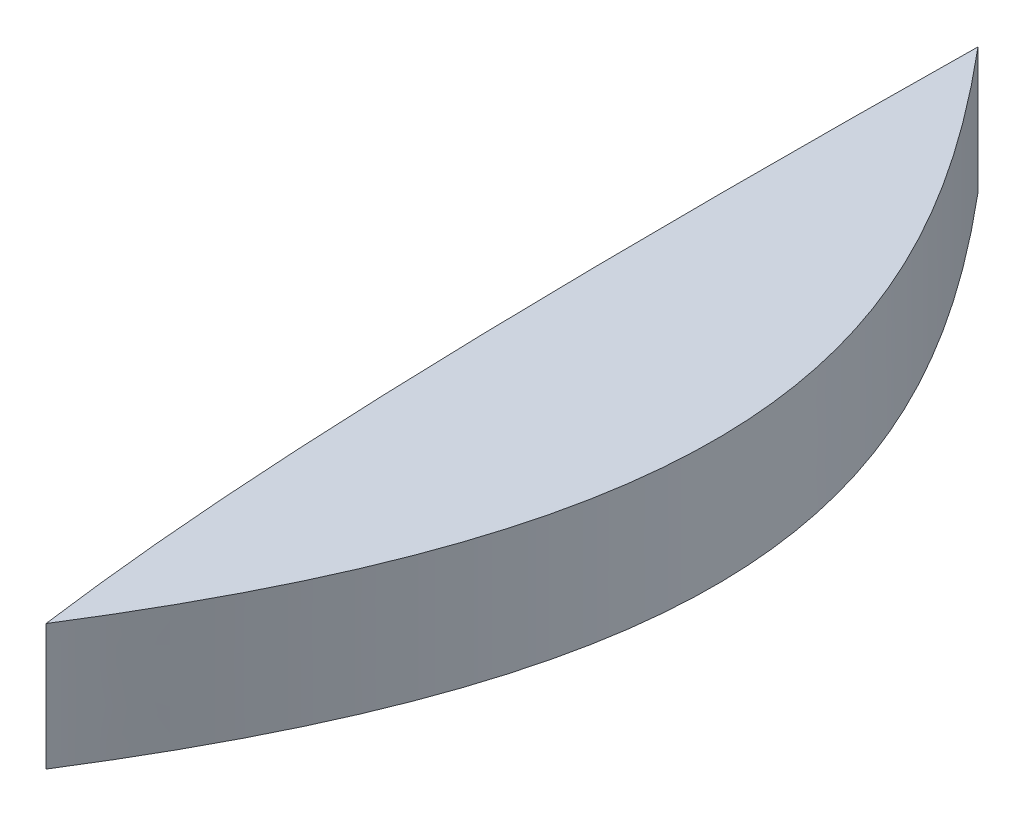
ISO-10303-21;
HEADER;
FILE_DESCRIPTION(('STEP AP214'),'2;1');
FILE_NAME('part.step','',(''),(''),'','','');
FILE_SCHEMA(('AUTOMOTIVE_DESIGN { 1 0 10303 214 1 1 1 1 }'));
ENDSEC;
DATA;
#1=APPLICATION_CONTEXT('core data for automotive mechanical design processes');
#2=APPLICATION_PROTOCOL_DEFINITION('international standard','automotive_design',2000,#1);
#3=PRODUCT_CONTEXT('',#1,'mechanical');
#4=PRODUCT('Part','Part','',(#3));
#5=PRODUCT_RELATED_PRODUCT_CATEGORY('part','',(#4));
#6=PRODUCT_DEFINITION_FORMATION('','',#4);
#7=PRODUCT_DEFINITION_CONTEXT('part definition',#1,'design');
#8=PRODUCT_DEFINITION('design','',#6,#7);
#9=PRODUCT_DEFINITION_SHAPE('','',#8);
#10=(LENGTH_UNIT() NAMED_UNIT(*) SI_UNIT(.MILLI.,.METRE.));
#11=(NAMED_UNIT(*) PLANE_ANGLE_UNIT() SI_UNIT($,.RADIAN.));
#12=(NAMED_UNIT(*) SI_UNIT($,.STERADIAN.) SOLID_ANGLE_UNIT());
#13=UNCERTAINTY_MEASURE_WITH_UNIT(LENGTH_MEASURE(1.E-05),#10,'distance_accuracy_value','');
#14=(GEOMETRIC_REPRESENTATION_CONTEXT(3) GLOBAL_UNCERTAINTY_ASSIGNED_CONTEXT((#13)) GLOBAL_UNIT_ASSIGNED_CONTEXT((#10,
#11,#12)) REPRESENTATION_CONTEXT('',''));
#15=CARTESIAN_POINT('',(0.,0.,0.));
#16=DIRECTION('',(0.,0.,1.));
#17=DIRECTION('',(1.,0.,0.));
#18=AXIS2_PLACEMENT_3D('',#15,#16,#17);
#19=CARTESIAN_POINT('',(76.4763346626368,-15.7359999999999,53.5629023710989));
#20=CARTESIAN_POINT('',(83.9772158726976,-15.7359999999999,62.471120596468));
#21=CARTESIAN_POINT('',(86.1364385946051,-15.7359999999999,70.5152754093578));
#22=CARTESIAN_POINT('',(77.5358351560387,-15.7359999999999,84.1913918151022));
#23=B_SPLINE_CURVE_WITH_KNOTS('',3,(#19,#20,#21,#22),.UNSPECIFIED.,.F.,.F.,(4,4),(0.,1.),.UNSPECIFIED.);
#24=DIRECTION('',(0.,1.,0.));
#25=VECTOR('',#24,1.);
#26=SURFACE_OF_LINEAR_EXTRUSION('',#23,#25);
#27=CARTESIAN_POINT('',(76.4763346626368,-11.7359999999999,53.5629023710989));
#28=CARTESIAN_POINT('',(83.9772158726976,-11.7359999999999,62.471120596468));
#29=CARTESIAN_POINT('',(86.1364385946051,-11.7359999999999,70.5152754093578));
#30=CARTESIAN_POINT('',(77.5358351560387,-11.7359999999999,84.1913918151022));
#31=B_SPLINE_CURVE_WITH_KNOTS('',3,(#27,#28,#29,#30),.UNSPECIFIED.,.F.,.F.,(4,4),(0.,1.),.UNSPECIFIED.);
#32=CARTESIAN_POINT('',(76.4764459270236,-11.7359999999999,53.5630345115315));
#33=VERTEX_POINT('',#32);
#34=CARTESIAN_POINT('',(77.5360614196237,-11.7359999999999,84.191032022917));
#35=VERTEX_POINT('',#34);
#36=EDGE_CURVE('E77',#33,#35,#31,.T.);
#37=ORIENTED_EDGE('',*,*,#36,.T.);
#38=DIRECTION('',(0.,1.,0.));
#39=VECTOR('',#38,1.);
#40=CARTESIAN_POINT('',(77.5360614196237,-15.7359999999999,84.191032022917));
#41=LINE('',#40,#39);
#42=CARTESIAN_POINT('',(77.5360614196237,-15.7359999999999,84.191032022917));
#43=VERTEX_POINT('',#42);
#44=EDGE_CURVE('E11',#43,#35,#41,.T.);
#45=ORIENTED_EDGE('',*,*,#44,.F.);
#46=CARTESIAN_POINT('',(76.4764459270236,-15.7359999999999,53.5630345115315));
#47=VERTEX_POINT('',#46);
#48=EDGE_CURVE('E71',#47,#43,#23,.T.);
#49=ORIENTED_EDGE('',*,*,#48,.F.);
#50=DIRECTION('',(0.,1.,0.));
#51=VECTOR('',#50,1.);
#52=CARTESIAN_POINT('',(76.4764459270236,-15.7359999999999,53.5630345115315));
#53=LINE('',#52,#51);
#54=EDGE_CURVE('E78',#47,#33,#53,.T.);
#55=ORIENTED_EDGE('',*,*,#54,.T.);
#56=EDGE_LOOP('',(#37,#45,#49,#55));
#57=FACE_BOUND('',#56,.T.);
#58=ADVANCED_FACE('F30',(#57),#26,.F.);
#59=CARTESIAN_POINT('',(77.5360614196237,-15.7359999999999,84.191032022917));
#60=DIRECTION('',(0.117809139059912,0.,-0.993036256515321));
#61=DIRECTION('',(-0.993036256515321,0.,-0.117809139059912));
#62=AXIS2_PLACEMENT_3D('',#59,#60,#61);
#63=PLANE('',#62);
#64=DIRECTION('',(-0.993036256515321,0.,-0.117809139059912));
#65=VECTOR('',#64,1.);
#66=CARTESIAN_POINT('',(77.5360614196237,-11.7359999999999,84.191032022917));
#67=LINE('',#66,#65);
#68=CARTESIAN_POINT('',(77.5359224096586,-11.7359999999999,84.1910155314302));
#69=VERTEX_POINT('',#68);
#70=EDGE_CURVE('E59',#35,#69,#67,.T.);
#71=ORIENTED_EDGE('',*,*,#70,.T.);
#72=DIRECTION('',(0.,1.,0.));
#73=VECTOR('',#72,1.);
#74=CARTESIAN_POINT('',(77.5359224096586,-15.7359999999999,84.1910155314302));
#75=LINE('',#74,#73);
#76=CARTESIAN_POINT('',(77.5359224096586,-15.7359999999999,84.1910155314302));
#77=VERTEX_POINT('',#76);
#78=EDGE_CURVE('E39',#77,#69,#75,.T.);
#79=ORIENTED_EDGE('',*,*,#78,.F.);
#80=DIRECTION('',(-0.993036256515321,0.,-0.117809139059912));
#81=VECTOR('',#80,1.);
#82=CARTESIAN_POINT('',(77.5360614196237,-15.7359999999999,84.191032022917));
#83=LINE('',#82,#81);
#84=EDGE_CURVE('E67',#43,#77,#83,.T.);
#85=ORIENTED_EDGE('',*,*,#84,.F.);
#86=ORIENTED_EDGE('',*,*,#44,.T.);
#87=EDGE_LOOP('',(#71,#79,#85,#86));
#88=FACE_BOUND('',#87,.T.);
#89=ADVANCED_FACE('F68',(#88),#63,.F.);
#90=CARTESIAN_POINT('',(77.5359482155555,-15.7359999999999,84.1912120346007));
#91=CARTESIAN_POINT('',(77.5028715050359,-15.7359999999999,83.939344079596));
#92=CARTESIAN_POINT('',(77.4367065558592,-15.7359999999999,83.4355203867232));
#93=CARTESIAN_POINT('',(77.3449752692857,-15.7359999999999,82.6785290550212));
#94=CARTESIAN_POINT('',(77.2459595278376,-15.7359999999999,81.8074242638747));
#95=CARTESIAN_POINT('',(77.1432297499354,-15.7359999999999,80.8168707922648));
#96=CARTESIAN_POINT('',(77.0063658952545,-15.7359999999999,79.3408986704013));
#97=CARTESIAN_POINT('',(76.8074950642307,-15.7359999999999,76.7535028366324));
#98=CARTESIAN_POINT('',(76.6153366055633,-15.7359999999999,73.0555317320625));
#99=CARTESIAN_POINT('',(76.4839254246952,-15.7359999999999,68.6142902194999));
#100=CARTESIAN_POINT('',(76.4240547149905,-15.7359999999999,64.1706781013149));
#101=CARTESIAN_POINT('',(76.4174921302925,-15.7359999999999,59.7259777298219));
#102=CARTESIAN_POINT('',(76.4430872015544,-15.7359999999999,56.1899519650158));
#103=CARTESIAN_POINT('',(76.4691730639972,-15.7359999999999,54.1357545586011));
#104=CARTESIAN_POINT('',(76.4764459270236,-15.7359999999999,53.5630345115315));
#105=B_SPLINE_CURVE_WITH_KNOTS('',3,(#90,#91,#92,#93,#94,#95,#96,#97,#98,#99,#100,#101,#102,
#103,#104),.UNSPECIFIED.,.F.,.F.,(4,1,1,1,1,1,1,1,1,1,1,1,4),(0.,0.024846780740293,
0.0497022212624952,0.0745823004380216,0.110598145599614,0.147106319784745,0.219564905527315,
0.364403668242395,0.509244520351113,0.654134017511262,0.799061349588922,0.943977344649467,1.),.UNSPECIFIED.);
#106=DIRECTION('',(0.,1.,0.));
#107=VECTOR('',#106,1.);
#108=SURFACE_OF_LINEAR_EXTRUSION('',#105,#107);
#109=CARTESIAN_POINT('',(77.5359482155555,-11.7359999999999,84.1912120346007));
#110=CARTESIAN_POINT('',(77.5028715050359,-11.7359999999999,83.939344079596));
#111=CARTESIAN_POINT('',(77.4367065558592,-11.7359999999999,83.4355203867232));
#112=CARTESIAN_POINT('',(77.3449752692857,-11.7359999999999,82.6785290550212));
#113=CARTESIAN_POINT('',(77.2459595278376,-11.7359999999999,81.8074242638747));
#114=CARTESIAN_POINT('',(77.1432297499354,-11.7359999999999,80.8168707922648));
#115=CARTESIAN_POINT('',(77.0063658952545,-11.7359999999999,79.3408986704013));
#116=CARTESIAN_POINT('',(76.8074950642307,-11.7359999999999,76.7535028366324));
#117=CARTESIAN_POINT('',(76.6153366055633,-11.7359999999999,73.0555317320625));
#118=CARTESIAN_POINT('',(76.4839254246952,-11.7359999999999,68.6142902194999));
#119=CARTESIAN_POINT('',(76.4240547149905,-11.7359999999999,64.1706781013149));
#120=CARTESIAN_POINT('',(76.4174921302925,-11.7359999999999,59.7259777298219));
#121=CARTESIAN_POINT('',(76.4430872015544,-11.7359999999999,56.1899519650158));
#122=CARTESIAN_POINT('',(76.4691730639972,-11.7359999999999,54.1357545586011));
#123=CARTESIAN_POINT('',(76.4764459270236,-11.7359999999999,53.5630345115315));
#124=B_SPLINE_CURVE_WITH_KNOTS('',3,(#109,#110,#111,#112,#113,#114,#115,#116,#117,#118,#119,
#120,#121,#122,#123),.UNSPECIFIED.,.F.,.F.,(4,1,1,1,1,1,1,1,1,1,1,1,4),(0.,0.024846780740293,
0.0497022212624952,0.0745823004380216,0.110598145599614,0.147106319784745,0.219564905527315,
0.364403668242395,0.509244520351113,0.654134017511262,0.799061349588922,0.943977344649467,1.),.UNSPECIFIED.);
#125=EDGE_CURVE('E64',#69,#33,#124,.T.);
#126=ORIENTED_EDGE('',*,*,#125,.T.);
#127=ORIENTED_EDGE('',*,*,#54,.F.);
#128=EDGE_CURVE('E47',#77,#47,#105,.T.);
#129=ORIENTED_EDGE('',*,*,#128,.F.);
#130=ORIENTED_EDGE('',*,*,#78,.T.);
#131=EDGE_LOOP('',(#126,#127,#129,#130));
#132=FACE_BOUND('',#131,.T.);
#133=ADVANCED_FACE('F98',(#132),#108,.F.);
#134=CARTESIAN_POINT('',(83.0441416525729,-15.7359999999999,67.0891852754598));
#135=DIRECTION('',(0.,1.,0.));
#136=DIRECTION('',(0.,0.,1.));
#137=AXIS2_PLACEMENT_3D('',#134,#135,#136);
#138=PLANE('',#137);
#139=ORIENTED_EDGE('',*,*,#48,.T.);
#140=ORIENTED_EDGE('',*,*,#84,.T.);
#141=ORIENTED_EDGE('',*,*,#128,.T.);
#142=EDGE_LOOP('',(#139,#140,#141));
#143=FACE_BOUND('',#142,.T.);
#144=ADVANCED_FACE('F74',(#143),#138,.F.);
#145=CARTESIAN_POINT('',(83.0441416525729,-11.7359999999999,67.0891852754598));
#146=DIRECTION('',(0.,1.,0.));
#147=DIRECTION('',(0.,0.,1.));
#148=AXIS2_PLACEMENT_3D('',#145,#146,#147);
#149=PLANE('',#148);
#150=ORIENTED_EDGE('',*,*,#36,.F.);
#151=ORIENTED_EDGE('',*,*,#125,.F.);
#152=ORIENTED_EDGE('',*,*,#70,.F.);
#153=EDGE_LOOP('',(#150,#151,#152));
#154=FACE_BOUND('',#153,.T.);
#155=ADVANCED_FACE('F99',(#154),#149,.T.);
#156=CLOSED_SHELL('',(#58,#89,#133,#144,#155));
#157=MANIFOLD_SOLID_BREP('B2',#156);
#158=ADVANCED_BREP_SHAPE_REPRESENTATION('',(#18,#157),#14);
#159=SHAPE_DEFINITION_REPRESENTATION(#9,#158);
ENDSEC;
END-ISO-10303-21;
